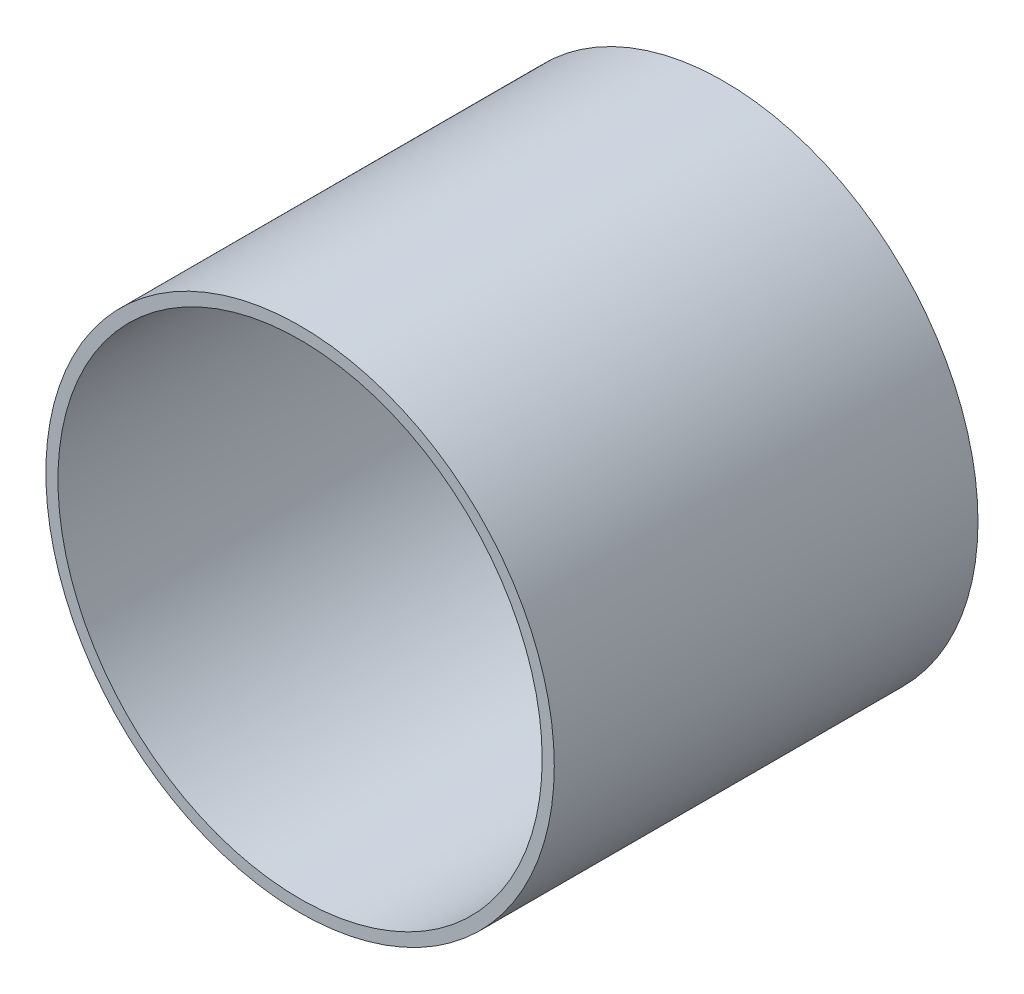
ISO-10303-21;
HEADER;
FILE_DESCRIPTION(('STEP AP214'),'2;1');
FILE_NAME('part.step','',(''),(''),'','','');
FILE_SCHEMA(('AUTOMOTIVE_DESIGN { 1 0 10303 214 1 1 1 1 }'));
ENDSEC;
DATA;
#1=APPLICATION_CONTEXT('core data for automotive mechanical design processes');
#2=APPLICATION_PROTOCOL_DEFINITION('international standard','automotive_design',2000,#1);
#3=PRODUCT_CONTEXT('',#1,'mechanical');
#4=PRODUCT('Part','Part','',(#3));
#5=PRODUCT_RELATED_PRODUCT_CATEGORY('part','',(#4));
#6=PRODUCT_DEFINITION_FORMATION('','',#4);
#7=PRODUCT_DEFINITION_CONTEXT('part definition',#1,'design');
#8=PRODUCT_DEFINITION('design','',#6,#7);
#9=PRODUCT_DEFINITION_SHAPE('','',#8);
#10=(LENGTH_UNIT() NAMED_UNIT(*) SI_UNIT(.MILLI.,.METRE.));
#11=(NAMED_UNIT(*) PLANE_ANGLE_UNIT() SI_UNIT($,.RADIAN.));
#12=(NAMED_UNIT(*) SI_UNIT($,.STERADIAN.) SOLID_ANGLE_UNIT());
#13=UNCERTAINTY_MEASURE_WITH_UNIT(LENGTH_MEASURE(1.E-05),#10,'distance_accuracy_value','');
#14=(GEOMETRIC_REPRESENTATION_CONTEXT(3) GLOBAL_UNCERTAINTY_ASSIGNED_CONTEXT((#13)) GLOBAL_UNIT_ASSIGNED_CONTEXT((#10,
#11,#12)) REPRESENTATION_CONTEXT('',''));
#15=CARTESIAN_POINT('',(0.,0.,0.));
#16=DIRECTION('',(0.,0.,1.));
#17=DIRECTION('',(1.,0.,0.));
#18=AXIS2_PLACEMENT_3D('',#15,#16,#17);
#19=CARTESIAN_POINT('',(0.,0.,228.));
#20=DIRECTION('',(0.,0.,1.));
#21=DIRECTION('',(1.,0.,0.));
#22=AXIS2_PLACEMENT_3D('',#19,#20,#21);
#23=PLANE('',#22);
#24=CARTESIAN_POINT('',(0.,0.,228.));
#25=DIRECTION('',(0.,0.,1.));
#26=DIRECTION('',(1.,0.,0.));
#27=AXIS2_PLACEMENT_3D('',#24,#25,#26);
#28=CIRCLE('',#27,16.8);
#29=CARTESIAN_POINT('',(16.8,0.,228.));
#30=VERTEX_POINT('',#29);
#31=EDGE_CURVE('E10',#30,#30,#28,.T.);
#32=ORIENTED_EDGE('',*,*,#31,.T.);
#33=EDGE_LOOP('',(#32));
#34=FACE_BOUND('',#33,.T.);
#35=CARTESIAN_POINT('',(0.,0.,228.));
#36=DIRECTION('',(0.,0.,1.));
#37=DIRECTION('',(1.,0.,0.));
#38=AXIS2_PLACEMENT_3D('',#35,#36,#37);
#39=CIRCLE('',#38,16.);
#40=CARTESIAN_POINT('',(16.,0.,228.));
#41=VERTEX_POINT('',#40);
#42=EDGE_CURVE('E49',#41,#41,#39,.T.);
#43=ORIENTED_EDGE('',*,*,#42,.F.);
#44=EDGE_LOOP('',(#43));
#45=FACE_BOUND('',#44,.T.);
#46=ADVANCED_FACE('F39',(#34,#45),#23,.T.);
#47=CARTESIAN_POINT('',(0.,0.,200.));
#48=DIRECTION('',(0.,0.,1.));
#49=DIRECTION('',(1.,0.,0.));
#50=AXIS2_PLACEMENT_3D('',#47,#48,#49);
#51=PLANE('',#50);
#52=CARTESIAN_POINT('',(0.,0.,200.));
#53=DIRECTION('',(0.,0.,1.));
#54=DIRECTION('',(1.,0.,0.));
#55=AXIS2_PLACEMENT_3D('',#52,#53,#54);
#56=CIRCLE('',#55,16.8);
#57=CARTESIAN_POINT('',(16.8,0.,200.));
#58=VERTEX_POINT('',#57);
#59=EDGE_CURVE('E43',#58,#58,#56,.T.);
#60=ORIENTED_EDGE('',*,*,#59,.F.);
#61=EDGE_LOOP('',(#60));
#62=FACE_BOUND('',#61,.T.);
#63=CARTESIAN_POINT('',(0.,0.,200.));
#64=DIRECTION('',(0.,0.,1.));
#65=DIRECTION('',(1.,0.,0.));
#66=AXIS2_PLACEMENT_3D('',#63,#64,#65);
#67=CIRCLE('',#66,16.);
#68=CARTESIAN_POINT('',(16.,0.,200.));
#69=VERTEX_POINT('',#68);
#70=EDGE_CURVE('E55',#69,#69,#67,.T.);
#71=ORIENTED_EDGE('',*,*,#70,.T.);
#72=EDGE_LOOP('',(#71));
#73=FACE_BOUND('',#72,.T.);
#74=ADVANCED_FACE('F65',(#62,#73),#51,.F.);
#75=CARTESIAN_POINT('',(0.,0.,228.));
#76=DIRECTION('',(0.,0.,-1.));
#77=DIRECTION('',(-1.,0.,0.));
#78=AXIS2_PLACEMENT_3D('',#75,#76,#77);
#79=CYLINDRICAL_SURFACE('',#78,16.8);
#80=ORIENTED_EDGE('',*,*,#31,.F.);
#81=EDGE_LOOP('',(#80));
#82=FACE_BOUND('',#81,.T.);
#83=ORIENTED_EDGE('',*,*,#59,.T.);
#84=EDGE_LOOP('',(#83));
#85=FACE_BOUND('',#84,.T.);
#86=ADVANCED_FACE('F41',(#82,#85),#79,.T.);
#87=CARTESIAN_POINT('',(0.,0.,228.));
#88=DIRECTION('',(0.,0.,-1.));
#89=DIRECTION('',(-1.,0.,0.));
#90=AXIS2_PLACEMENT_3D('',#87,#88,#89);
#91=CYLINDRICAL_SURFACE('',#90,16.);
#92=ORIENTED_EDGE('',*,*,#42,.T.);
#93=EDGE_LOOP('',(#92));
#94=FACE_BOUND('',#93,.T.);
#95=ORIENTED_EDGE('',*,*,#70,.F.);
#96=EDGE_LOOP('',(#95));
#97=FACE_BOUND('',#96,.T.);
#98=ADVANCED_FACE('F59',(#94,#97),#91,.F.);
#99=CLOSED_SHELL('',(#46,#74,#86,#98));
#100=MANIFOLD_SOLID_BREP('B2',#99);
#101=ADVANCED_BREP_SHAPE_REPRESENTATION('',(#18,#100),#14);
#102=SHAPE_DEFINITION_REPRESENTATION(#9,#101);
ENDSEC;
END-ISO-10303-21;
